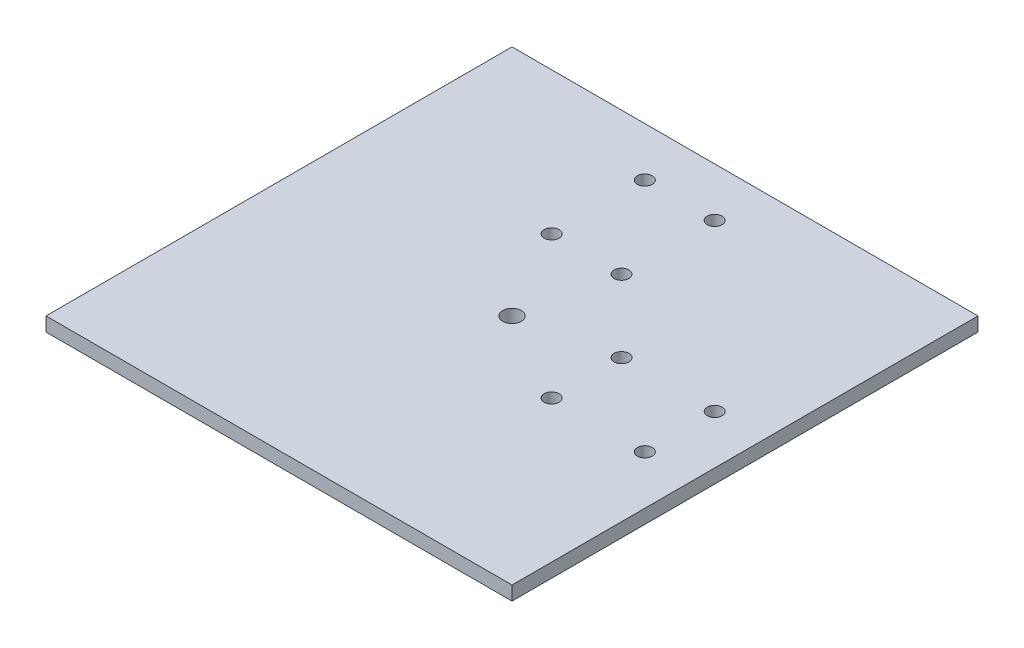
ISO-10303-21;
HEADER;
FILE_DESCRIPTION(('STEP AP214'),'2;1');
FILE_NAME('part.step','',(''),(''),'','','');
FILE_SCHEMA(('AUTOMOTIVE_DESIGN { 1 0 10303 214 1 1 1 1 }'));
ENDSEC;
DATA;
#1=APPLICATION_CONTEXT('core data for automotive mechanical design processes');
#2=APPLICATION_PROTOCOL_DEFINITION('international standard','automotive_design',2000,#1);
#3=PRODUCT_CONTEXT('',#1,'mechanical');
#4=PRODUCT('Part','Part','',(#3));
#5=PRODUCT_RELATED_PRODUCT_CATEGORY('part','',(#4));
#6=PRODUCT_DEFINITION_FORMATION('','',#4);
#7=PRODUCT_DEFINITION_CONTEXT('part definition',#1,'design');
#8=PRODUCT_DEFINITION('design','',#6,#7);
#9=PRODUCT_DEFINITION_SHAPE('','',#8);
#10=(LENGTH_UNIT() NAMED_UNIT(*) SI_UNIT(.MILLI.,.METRE.));
#11=(NAMED_UNIT(*) PLANE_ANGLE_UNIT() SI_UNIT($,.RADIAN.));
#12=(NAMED_UNIT(*) SI_UNIT($,.STERADIAN.) SOLID_ANGLE_UNIT());
#13=UNCERTAINTY_MEASURE_WITH_UNIT(LENGTH_MEASURE(1.E-05),#10,'distance_accuracy_value','');
#14=(GEOMETRIC_REPRESENTATION_CONTEXT(3) GLOBAL_UNCERTAINTY_ASSIGNED_CONTEXT((#13)) GLOBAL_UNIT_ASSIGNED_CONTEXT((#10,
#11,#12)) REPRESENTATION_CONTEXT('',''));
#15=CARTESIAN_POINT('',(0.,0.,0.));
#16=DIRECTION('',(0.,0.,1.));
#17=DIRECTION('',(1.,0.,0.));
#18=AXIS2_PLACEMENT_3D('',#15,#16,#17);
#19=CARTESIAN_POINT('',(-50.,3.,50.));
#20=DIRECTION('',(1.,0.,0.));
#21=DIRECTION('',(0.,0.,-1.));
#22=AXIS2_PLACEMENT_3D('',#19,#20,#21);
#23=PLANE('',#22);
#24=DIRECTION('',(0.,0.,1.));
#25=VECTOR('',#24,1.);
#26=CARTESIAN_POINT('',(-50.,0.,50.));
#27=LINE('',#26,#25);
#28=CARTESIAN_POINT('',(-50.,0.,-50.));
#29=VERTEX_POINT('',#28);
#30=CARTESIAN_POINT('',(-50.,0.,50.));
#31=VERTEX_POINT('',#30);
#32=EDGE_CURVE('E106',#29,#31,#27,.T.);
#33=ORIENTED_EDGE('',*,*,#32,.T.);
#34=DIRECTION('',(0.,-1.,0.));
#35=VECTOR('',#34,1.);
#36=CARTESIAN_POINT('',(-50.,3.,50.));
#37=LINE('',#36,#35);
#38=CARTESIAN_POINT('',(-50.,3.,50.));
#39=VERTEX_POINT('',#38);
#40=EDGE_CURVE('E97',#39,#31,#37,.T.);
#41=ORIENTED_EDGE('',*,*,#40,.F.);
#42=DIRECTION('',(0.,0.,1.));
#43=VECTOR('',#42,1.);
#44=CARTESIAN_POINT('',(-50.,3.,50.));
#45=LINE('',#44,#43);
#46=CARTESIAN_POINT('',(-50.,3.,-50.));
#47=VERTEX_POINT('',#46);
#48=EDGE_CURVE('E91',#47,#39,#45,.T.);
#49=ORIENTED_EDGE('',*,*,#48,.F.);
#50=DIRECTION('',(0.,-1.,0.));
#51=VECTOR('',#50,1.);
#52=CARTESIAN_POINT('',(-50.,3.,-50.));
#53=LINE('',#52,#51);
#54=EDGE_CURVE('E102',#47,#29,#53,.T.);
#55=ORIENTED_EDGE('',*,*,#54,.T.);
#56=EDGE_LOOP('',(#33,#41,#49,#55));
#57=FACE_BOUND('',#56,.T.);
#58=ADVANCED_FACE('F37',(#57),#23,.F.);
#59=CARTESIAN_POINT('',(50.,3.,50.));
#60=DIRECTION('',(0.,0.,-1.));
#61=DIRECTION('',(-1.,0.,0.));
#62=AXIS2_PLACEMENT_3D('',#59,#60,#61);
#63=PLANE('',#62);
#64=DIRECTION('',(1.,0.,0.));
#65=VECTOR('',#64,1.);
#66=CARTESIAN_POINT('',(50.,0.,50.));
#67=LINE('',#66,#65);
#68=CARTESIAN_POINT('',(50.,0.,50.));
#69=VERTEX_POINT('',#68);
#70=EDGE_CURVE('E96',#31,#69,#67,.T.);
#71=ORIENTED_EDGE('',*,*,#70,.T.);
#72=DIRECTION('',(0.,-1.,0.));
#73=VECTOR('',#72,1.);
#74=CARTESIAN_POINT('',(50.,3.,50.));
#75=LINE('',#74,#73);
#76=CARTESIAN_POINT('',(50.,3.,50.));
#77=VERTEX_POINT('',#76);
#78=EDGE_CURVE('E94',#77,#69,#75,.T.);
#79=ORIENTED_EDGE('',*,*,#78,.F.);
#80=DIRECTION('',(1.,0.,0.));
#81=VECTOR('',#80,1.);
#82=CARTESIAN_POINT('',(50.,3.,50.));
#83=LINE('',#82,#81);
#84=EDGE_CURVE('E86',#39,#77,#83,.T.);
#85=ORIENTED_EDGE('',*,*,#84,.F.);
#86=ORIENTED_EDGE('',*,*,#40,.T.);
#87=EDGE_LOOP('',(#71,#79,#85,#86));
#88=FACE_BOUND('',#87,.T.);
#89=ADVANCED_FACE('F95',(#88),#63,.F.);
#90=CARTESIAN_POINT('',(50.,3.,50.));
#91=DIRECTION('',(-1.,0.,0.));
#92=DIRECTION('',(0.,0.,1.));
#93=AXIS2_PLACEMENT_3D('',#90,#91,#92);
#94=PLANE('',#93);
#95=DIRECTION('',(0.,0.,-1.));
#96=VECTOR('',#95,1.);
#97=CARTESIAN_POINT('',(50.,0.,50.));
#98=LINE('',#97,#96);
#99=CARTESIAN_POINT('',(50.,0.,-50.));
#100=VERTEX_POINT('',#99);
#101=EDGE_CURVE('E72',#69,#100,#98,.T.);
#102=ORIENTED_EDGE('',*,*,#101,.T.);
#103=DIRECTION('',(0.,-1.,0.));
#104=VECTOR('',#103,1.);
#105=CARTESIAN_POINT('',(50.,3.,-50.));
#106=LINE('',#105,#104);
#107=CARTESIAN_POINT('',(50.,3.,-50.));
#108=VERTEX_POINT('',#107);
#109=EDGE_CURVE('E98',#108,#100,#106,.T.);
#110=ORIENTED_EDGE('',*,*,#109,.F.);
#111=DIRECTION('',(0.,0.,-1.));
#112=VECTOR('',#111,1.);
#113=CARTESIAN_POINT('',(50.,3.,50.));
#114=LINE('',#113,#112);
#115=EDGE_CURVE('E89',#77,#108,#114,.T.);
#116=ORIENTED_EDGE('',*,*,#115,.F.);
#117=ORIENTED_EDGE('',*,*,#78,.T.);
#118=EDGE_LOOP('',(#102,#110,#116,#117));
#119=FACE_BOUND('',#118,.T.);
#120=ADVANCED_FACE('F100',(#119),#94,.F.);
#121=CARTESIAN_POINT('',(50.,3.,-50.));
#122=DIRECTION('',(0.,0.,1.));
#123=DIRECTION('',(1.,0.,0.));
#124=AXIS2_PLACEMENT_3D('',#121,#122,#123);
#125=PLANE('',#124);
#126=DIRECTION('',(-1.,0.,0.));
#127=VECTOR('',#126,1.);
#128=CARTESIAN_POINT('',(50.,0.,-50.));
#129=LINE('',#128,#127);
#130=EDGE_CURVE('E78',#100,#29,#129,.T.);
#131=ORIENTED_EDGE('',*,*,#130,.T.);
#132=ORIENTED_EDGE('',*,*,#54,.F.);
#133=DIRECTION('',(-1.,0.,0.));
#134=VECTOR('',#133,1.);
#135=CARTESIAN_POINT('',(50.,3.,-50.));
#136=LINE('',#135,#134);
#137=EDGE_CURVE('E55',#108,#47,#136,.T.);
#138=ORIENTED_EDGE('',*,*,#137,.F.);
#139=ORIENTED_EDGE('',*,*,#109,.T.);
#140=EDGE_LOOP('',(#131,#132,#138,#139));
#141=FACE_BOUND('',#140,.T.);
#142=ADVANCED_FACE('F176',(#141),#125,.F.);
#143=CARTESIAN_POINT('',(0.,3.,0.));
#144=DIRECTION('',(0.,1.,0.));
#145=DIRECTION('',(0.,0.,1.));
#146=AXIS2_PLACEMENT_3D('',#143,#144,#145);
#147=PLANE('',#146);
#148=CARTESIAN_POINT('',(0.,3.,0.));
#149=DIRECTION('',(0.,1.,0.));
#150=DIRECTION('',(0.,0.,1.));
#151=AXIS2_PLACEMENT_3D('',#148,#149,#150);
#152=CIRCLE('',#151,2.);
#153=CARTESIAN_POINT('',(0.,3.,2.));
#154=VERTEX_POINT('',#153);
#155=EDGE_CURVE('E435',#154,#154,#152,.T.);
#156=ORIENTED_EDGE('',*,*,#155,.F.);
#157=EDGE_LOOP('',(#156));
#158=FACE_BOUND('',#157,.T.);
#159=CARTESIAN_POINT('',(-11.,3.,-39.5));
#160=DIRECTION('',(0.,1.,0.));
#161=DIRECTION('',(0.,0.,1.));
#162=AXIS2_PLACEMENT_3D('',#159,#160,#161);
#163=CIRCLE('',#162,1.6);
#164=CARTESIAN_POINT('',(-11.,3.,-37.9));
#165=VERTEX_POINT('',#164);
#166=EDGE_CURVE('E439',#165,#165,#163,.T.);
#167=ORIENTED_EDGE('',*,*,#166,.F.);
#168=EDGE_LOOP('',(#167));
#169=FACE_BOUND('',#168,.T.);
#170=CARTESIAN_POINT('',(4.,3.,-39.5));
#171=DIRECTION('',(0.,1.,0.));
#172=DIRECTION('',(0.,0.,1.));
#173=AXIS2_PLACEMENT_3D('',#170,#171,#172);
#174=CIRCLE('',#173,1.6);
#175=CARTESIAN_POINT('',(4.,3.,-37.9));
#176=VERTEX_POINT('',#175);
#177=EDGE_CURVE('E448',#176,#176,#174,.T.);
#178=ORIENTED_EDGE('',*,*,#177,.F.);
#179=EDGE_LOOP('',(#178));
#180=FACE_BOUND('',#179,.T.);
#181=CARTESIAN_POINT('',(4.,3.,-19.5));
#182=DIRECTION('',(0.,1.,0.));
#183=DIRECTION('',(0.,0.,1.));
#184=AXIS2_PLACEMENT_3D('',#181,#182,#183);
#185=CIRCLE('',#184,1.6);
#186=CARTESIAN_POINT('',(4.,3.,-17.9));
#187=VERTEX_POINT('',#186);
#188=EDGE_CURVE('E454',#187,#187,#185,.T.);
#189=ORIENTED_EDGE('',*,*,#188,.F.);
#190=EDGE_LOOP('',(#189));
#191=FACE_BOUND('',#190,.T.);
#192=CARTESIAN_POINT('',(-11.,3.,-19.5));
#193=DIRECTION('',(0.,1.,0.));
#194=DIRECTION('',(0.,0.,1.));
#195=AXIS2_PLACEMENT_3D('',#192,#193,#194);
#196=CIRCLE('',#195,1.6);
#197=CARTESIAN_POINT('',(-11.,3.,-17.9));
#198=VERTEX_POINT('',#197);
#199=EDGE_CURVE('E460',#198,#198,#196,.T.);
#200=ORIENTED_EDGE('',*,*,#199,.F.);
#201=EDGE_LOOP('',(#200));
#202=FACE_BOUND('',#201,.T.);
#203=CARTESIAN_POINT('',(19.5,3.,-3.99999999999999));
#204=DIRECTION('',(0.,1.,0.));
#205=DIRECTION('',(0.,0.,1.));
#206=AXIS2_PLACEMENT_3D('',#203,#204,#205);
#207=CIRCLE('',#206,1.6);
#208=CARTESIAN_POINT('',(19.5,3.,-2.39999999999999));
#209=VERTEX_POINT('',#208);
#210=EDGE_CURVE('E144',#209,#209,#207,.T.);
#211=ORIENTED_EDGE('',*,*,#210,.F.);
#212=EDGE_LOOP('',(#211));
#213=FACE_BOUND('',#212,.T.);
#214=CARTESIAN_POINT('',(39.5,3.,-4.));
#215=DIRECTION('',(0.,1.,0.));
#216=DIRECTION('',(0.,0.,1.));
#217=AXIS2_PLACEMENT_3D('',#214,#215,#216);
#218=CIRCLE('',#217,1.6);
#219=CARTESIAN_POINT('',(39.5,3.,-2.4));
#220=VERTEX_POINT('',#219);
#221=EDGE_CURVE('E134',#220,#220,#218,.T.);
#222=ORIENTED_EDGE('',*,*,#221,.F.);
#223=EDGE_LOOP('',(#222));
#224=FACE_BOUND('',#223,.T.);
#225=CARTESIAN_POINT('',(39.5,3.,11.));
#226=DIRECTION('',(0.,1.,0.));
#227=DIRECTION('',(0.,0.,1.));
#228=AXIS2_PLACEMENT_3D('',#225,#226,#227);
#229=CIRCLE('',#228,1.6);
#230=CARTESIAN_POINT('',(39.5,3.,12.6));
#231=VERTEX_POINT('',#230);
#232=EDGE_CURVE('E131',#231,#231,#229,.T.);
#233=ORIENTED_EDGE('',*,*,#232,.F.);
#234=EDGE_LOOP('',(#233));
#235=FACE_BOUND('',#234,.T.);
#236=CARTESIAN_POINT('',(19.5,3.,11.));
#237=DIRECTION('',(0.,1.,0.));
#238=DIRECTION('',(0.,0.,1.));
#239=AXIS2_PLACEMENT_3D('',#236,#237,#238);
#240=CIRCLE('',#239,1.6);
#241=CARTESIAN_POINT('',(19.5,3.,12.6));
#242=VERTEX_POINT('',#241);
#243=EDGE_CURVE('E128',#242,#242,#240,.T.);
#244=ORIENTED_EDGE('',*,*,#243,.F.);
#245=EDGE_LOOP('',(#244));
#246=FACE_BOUND('',#245,.T.);
#247=ORIENTED_EDGE('',*,*,#48,.T.);
#248=ORIENTED_EDGE('',*,*,#84,.T.);
#249=ORIENTED_EDGE('',*,*,#115,.T.);
#250=ORIENTED_EDGE('',*,*,#137,.T.);
#251=EDGE_LOOP('',(#247,#248,#249,#250));
#252=FACE_BOUND('',#251,.T.);
#253=ADVANCED_FACE('F87',(#158,#169,#180,#191,#202,#213,#224,#235,#246,#252),#147,.T.);
#254=CARTESIAN_POINT('',(0.,0.,0.));
#255=DIRECTION('',(0.,1.,0.));
#256=DIRECTION('',(0.,0.,1.));
#257=AXIS2_PLACEMENT_3D('',#254,#255,#256);
#258=PLANE('',#257);
#259=CARTESIAN_POINT('',(0.,0.,0.));
#260=DIRECTION('',(0.,1.,0.));
#261=DIRECTION('',(0.,0.,1.));
#262=AXIS2_PLACEMENT_3D('',#259,#260,#261);
#263=CIRCLE('',#262,2.);
#264=CARTESIAN_POINT('',(0.,0.,2.));
#265=VERTEX_POINT('',#264);
#266=EDGE_CURVE('E438',#265,#265,#263,.T.);
#267=ORIENTED_EDGE('',*,*,#266,.T.);
#268=EDGE_LOOP('',(#267));
#269=FACE_BOUND('',#268,.T.);
#270=CARTESIAN_POINT('',(19.5,0.,-3.99999999999999));
#271=DIRECTION('',(0.,1.,0.));
#272=DIRECTION('',(0.,0.,1.));
#273=AXIS2_PLACEMENT_3D('',#270,#271,#272);
#274=CIRCLE('',#273,1.6);
#275=CARTESIAN_POINT('',(19.5,0.,-2.4));
#276=VERTEX_POINT('',#275);
#277=EDGE_CURVE('E40',#276,#276,#274,.T.);
#278=ORIENTED_EDGE('',*,*,#277,.T.);
#279=EDGE_LOOP('',(#278));
#280=FACE_BOUND('',#279,.T.);
#281=CARTESIAN_POINT('',(39.5,0.,-4.));
#282=DIRECTION('',(0.,1.,0.));
#283=DIRECTION('',(0.,0.,1.));
#284=AXIS2_PLACEMENT_3D('',#281,#282,#283);
#285=CIRCLE('',#284,1.6);
#286=CARTESIAN_POINT('',(39.5,0.,-2.4));
#287=VERTEX_POINT('',#286);
#288=EDGE_CURVE('E132',#287,#287,#285,.T.);
#289=ORIENTED_EDGE('',*,*,#288,.T.);
#290=EDGE_LOOP('',(#289));
#291=FACE_BOUND('',#290,.T.);
#292=CARTESIAN_POINT('',(39.5,0.,11.));
#293=DIRECTION('',(0.,1.,0.));
#294=DIRECTION('',(0.,0.,1.));
#295=AXIS2_PLACEMENT_3D('',#292,#293,#294);
#296=CIRCLE('',#295,1.6);
#297=CARTESIAN_POINT('',(39.5,0.,12.6));
#298=VERTEX_POINT('',#297);
#299=EDGE_CURVE('E129',#298,#298,#296,.T.);
#300=ORIENTED_EDGE('',*,*,#299,.T.);
#301=EDGE_LOOP('',(#300));
#302=FACE_BOUND('',#301,.T.);
#303=CARTESIAN_POINT('',(19.5,0.,11.));
#304=DIRECTION('',(0.,1.,0.));
#305=DIRECTION('',(0.,0.,1.));
#306=AXIS2_PLACEMENT_3D('',#303,#304,#305);
#307=CIRCLE('',#306,1.6);
#308=CARTESIAN_POINT('',(19.5,0.,12.6));
#309=VERTEX_POINT('',#308);
#310=EDGE_CURVE('E124',#309,#309,#307,.T.);
#311=ORIENTED_EDGE('',*,*,#310,.T.);
#312=EDGE_LOOP('',(#311));
#313=FACE_BOUND('',#312,.T.);
#314=CARTESIAN_POINT('',(-11.,0.,-39.5));
#315=DIRECTION('',(0.,1.,0.));
#316=DIRECTION('',(0.,0.,1.));
#317=AXIS2_PLACEMENT_3D('',#314,#315,#316);
#318=CIRCLE('',#317,3.);
#319=CARTESIAN_POINT('',(-11.,0.,-36.5));
#320=VERTEX_POINT('',#319);
#321=EDGE_CURVE('E11',#320,#320,#318,.F.);
#322=ORIENTED_EDGE('',*,*,#321,.F.);
#323=EDGE_LOOP('',(#322));
#324=FACE_BOUND('',#323,.T.);
#325=CARTESIAN_POINT('',(4.,0.,-39.5));
#326=DIRECTION('',(0.,1.,0.));
#327=DIRECTION('',(0.,0.,1.));
#328=AXIS2_PLACEMENT_3D('',#325,#326,#327);
#329=CIRCLE('',#328,3.);
#330=CARTESIAN_POINT('',(4.,0.,-36.5));
#331=VERTEX_POINT('',#330);
#332=EDGE_CURVE('E46',#331,#331,#329,.F.);
#333=ORIENTED_EDGE('',*,*,#332,.F.);
#334=EDGE_LOOP('',(#333));
#335=FACE_BOUND('',#334,.T.);
#336=CARTESIAN_POINT('',(4.,0.,-19.5));
#337=DIRECTION('',(0.,1.,0.));
#338=DIRECTION('',(0.,0.,1.));
#339=AXIS2_PLACEMENT_3D('',#336,#337,#338);
#340=CIRCLE('',#339,3.);
#341=CARTESIAN_POINT('',(4.,0.,-16.5));
#342=VERTEX_POINT('',#341);
#343=EDGE_CURVE('E119',#342,#342,#340,.F.);
#344=ORIENTED_EDGE('',*,*,#343,.F.);
#345=EDGE_LOOP('',(#344));
#346=FACE_BOUND('',#345,.T.);
#347=CARTESIAN_POINT('',(-11.,0.,-19.5));
#348=DIRECTION('',(0.,1.,0.));
#349=DIRECTION('',(0.,0.,1.));
#350=AXIS2_PLACEMENT_3D('',#347,#348,#349);
#351=CIRCLE('',#350,3.);
#352=CARTESIAN_POINT('',(-11.,0.,-16.5));
#353=VERTEX_POINT('',#352);
#354=EDGE_CURVE('E116',#353,#353,#351,.F.);
#355=ORIENTED_EDGE('',*,*,#354,.F.);
#356=EDGE_LOOP('',(#355));
#357=FACE_BOUND('',#356,.T.);
#358=ORIENTED_EDGE('',*,*,#32,.F.);
#359=ORIENTED_EDGE('',*,*,#130,.F.);
#360=ORIENTED_EDGE('',*,*,#101,.F.);
#361=ORIENTED_EDGE('',*,*,#70,.F.);
#362=EDGE_LOOP('',(#358,#359,#360,#361));
#363=FACE_BOUND('',#362,.T.);
#364=ADVANCED_FACE('F166',(#269,#280,#291,#302,#313,#324,#335,#346,#357,#363),#258,.F.);
#365=CARTESIAN_POINT('',(-11.,-15.1,-19.5));
#366=DIRECTION('',(0.,1.,0.));
#367=DIRECTION('',(0.,0.,1.));
#368=AXIS2_PLACEMENT_3D('',#365,#366,#367);
#369=CYLINDRICAL_SURFACE('',#368,3.);
#370=CARTESIAN_POINT('',(-11.,-15.1,-19.5));
#371=DIRECTION('',(0.,-1.,0.));
#372=DIRECTION('',(0.,0.,-1.));
#373=AXIS2_PLACEMENT_3D('',#370,#371,#372);
#374=CIRCLE('',#373,3.);
#375=CARTESIAN_POINT('',(-11.,-15.1,-22.5));
#376=VERTEX_POINT('',#375);
#377=EDGE_CURVE('E109',#376,#376,#374,.T.);
#378=ORIENTED_EDGE('',*,*,#377,.F.);
#379=EDGE_LOOP('',(#378));
#380=FACE_BOUND('',#379,.T.);
#381=ORIENTED_EDGE('',*,*,#354,.T.);
#382=EDGE_LOOP('',(#381));
#383=FACE_BOUND('',#382,.T.);
#384=ADVANCED_FACE('F163',(#380,#383),#369,.T.);
#385=CARTESIAN_POINT('',(-11.,-15.1,-19.5));
#386=DIRECTION('',(0.,-1.,0.));
#387=DIRECTION('',(0.,0.,-1.));
#388=AXIS2_PLACEMENT_3D('',#385,#386,#387);
#389=PLANE('',#388);
#390=CARTESIAN_POINT('',(-11.,-15.1,-19.5));
#391=DIRECTION('',(0.,1.,0.));
#392=DIRECTION('',(0.,0.,1.));
#393=AXIS2_PLACEMENT_3D('',#390,#391,#392);
#394=CIRCLE('',#393,1.6);
#395=CARTESIAN_POINT('',(-11.,-15.1,-17.9));
#396=VERTEX_POINT('',#395);
#397=EDGE_CURVE('E462',#396,#396,#394,.T.);
#398=ORIENTED_EDGE('',*,*,#397,.T.);
#399=EDGE_LOOP('',(#398));
#400=FACE_BOUND('',#399,.T.);
#401=ORIENTED_EDGE('',*,*,#377,.T.);
#402=EDGE_LOOP('',(#401));
#403=FACE_BOUND('',#402,.T.);
#404=ADVANCED_FACE('F161',(#400,#403),#389,.T.);
#405=CARTESIAN_POINT('',(4.,-15.1,-19.5));
#406=DIRECTION('',(0.,1.,0.));
#407=DIRECTION('',(0.,0.,1.));
#408=AXIS2_PLACEMENT_3D('',#405,#406,#407);
#409=CYLINDRICAL_SURFACE('',#408,3.);
#410=CARTESIAN_POINT('',(4.,-15.1,-19.5));
#411=DIRECTION('',(0.,-1.,0.));
#412=DIRECTION('',(0.,0.,-1.));
#413=AXIS2_PLACEMENT_3D('',#410,#411,#412);
#414=CIRCLE('',#413,3.);
#415=CARTESIAN_POINT('',(4.,-15.1,-22.5));
#416=VERTEX_POINT('',#415);
#417=EDGE_CURVE('E155',#416,#416,#414,.T.);
#418=ORIENTED_EDGE('',*,*,#417,.F.);
#419=EDGE_LOOP('',(#418));
#420=FACE_BOUND('',#419,.T.);
#421=ORIENTED_EDGE('',*,*,#343,.T.);
#422=EDGE_LOOP('',(#421));
#423=FACE_BOUND('',#422,.T.);
#424=ADVANCED_FACE('F218',(#420,#423),#409,.T.);
#425=CARTESIAN_POINT('',(4.,-15.1,-19.5));
#426=DIRECTION('',(0.,-1.,0.));
#427=DIRECTION('',(0.,0.,-1.));
#428=AXIS2_PLACEMENT_3D('',#425,#426,#427);
#429=PLANE('',#428);
#430=CARTESIAN_POINT('',(4.,-15.1,-19.5));
#431=DIRECTION('',(0.,1.,0.));
#432=DIRECTION('',(0.,0.,1.));
#433=AXIS2_PLACEMENT_3D('',#430,#431,#432);
#434=CIRCLE('',#433,1.6);
#435=CARTESIAN_POINT('',(4.,-15.1,-17.9));
#436=VERTEX_POINT('',#435);
#437=EDGE_CURVE('E457',#436,#436,#434,.T.);
#438=ORIENTED_EDGE('',*,*,#437,.T.);
#439=EDGE_LOOP('',(#438));
#440=FACE_BOUND('',#439,.T.);
#441=ORIENTED_EDGE('',*,*,#417,.T.);
#442=EDGE_LOOP('',(#441));
#443=FACE_BOUND('',#442,.T.);
#444=ADVANCED_FACE('F223',(#440,#443),#429,.T.);
#445=CARTESIAN_POINT('',(4.,-15.1,-39.5));
#446=DIRECTION('',(0.,1.,0.));
#447=DIRECTION('',(0.,0.,1.));
#448=AXIS2_PLACEMENT_3D('',#445,#446,#447);
#449=CYLINDRICAL_SURFACE('',#448,3.);
#450=CARTESIAN_POINT('',(4.,-15.1,-39.5));
#451=DIRECTION('',(0.,-1.,0.));
#452=DIRECTION('',(0.,0.,-1.));
#453=AXIS2_PLACEMENT_3D('',#450,#451,#452);
#454=CIRCLE('',#453,3.);
#455=CARTESIAN_POINT('',(4.,-15.1,-42.5));
#456=VERTEX_POINT('',#455);
#457=EDGE_CURVE('E152',#456,#456,#454,.T.);
#458=ORIENTED_EDGE('',*,*,#457,.F.);
#459=EDGE_LOOP('',(#458));
#460=FACE_BOUND('',#459,.T.);
#461=ORIENTED_EDGE('',*,*,#332,.T.);
#462=EDGE_LOOP('',(#461));
#463=FACE_BOUND('',#462,.T.);
#464=ADVANCED_FACE('F232',(#460,#463),#449,.T.);
#465=CARTESIAN_POINT('',(4.,-15.1,-39.5));
#466=DIRECTION('',(0.,-1.,0.));
#467=DIRECTION('',(0.,0.,-1.));
#468=AXIS2_PLACEMENT_3D('',#465,#466,#467);
#469=PLANE('',#468);
#470=CARTESIAN_POINT('',(4.,-15.1,-39.5));
#471=DIRECTION('',(0.,1.,0.));
#472=DIRECTION('',(0.,0.,1.));
#473=AXIS2_PLACEMENT_3D('',#470,#471,#472);
#474=CIRCLE('',#473,1.6);
#475=CARTESIAN_POINT('',(4.,-15.1,-37.9));
#476=VERTEX_POINT('',#475);
#477=EDGE_CURVE('E451',#476,#476,#474,.T.);
#478=ORIENTED_EDGE('',*,*,#477,.T.);
#479=EDGE_LOOP('',(#478));
#480=FACE_BOUND('',#479,.T.);
#481=ORIENTED_EDGE('',*,*,#457,.T.);
#482=EDGE_LOOP('',(#481));
#483=FACE_BOUND('',#482,.T.);
#484=ADVANCED_FACE('F237',(#480,#483),#469,.T.);
#485=CARTESIAN_POINT('',(-11.,-15.1,-39.5));
#486=DIRECTION('',(0.,1.,0.));
#487=DIRECTION('',(0.,0.,1.));
#488=AXIS2_PLACEMENT_3D('',#485,#486,#487);
#489=CYLINDRICAL_SURFACE('',#488,3.);
#490=CARTESIAN_POINT('',(-11.,-15.1,-39.5));
#491=DIRECTION('',(0.,-1.,0.));
#492=DIRECTION('',(0.,0.,-1.));
#493=AXIS2_PLACEMENT_3D('',#490,#491,#492);
#494=CIRCLE('',#493,3.);
#495=CARTESIAN_POINT('',(-11.,-15.1,-42.5));
#496=VERTEX_POINT('',#495);
#497=EDGE_CURVE('E127',#496,#496,#494,.T.);
#498=ORIENTED_EDGE('',*,*,#497,.F.);
#499=EDGE_LOOP('',(#498));
#500=FACE_BOUND('',#499,.T.);
#501=ORIENTED_EDGE('',*,*,#321,.T.);
#502=EDGE_LOOP('',(#501));
#503=FACE_BOUND('',#502,.T.);
#504=ADVANCED_FACE('F246',(#500,#503),#489,.T.);
#505=CARTESIAN_POINT('',(-11.,-15.1,-39.5));
#506=DIRECTION('',(0.,-1.,0.));
#507=DIRECTION('',(0.,0.,-1.));
#508=AXIS2_PLACEMENT_3D('',#505,#506,#507);
#509=PLANE('',#508);
#510=CARTESIAN_POINT('',(-11.,-15.1,-39.5));
#511=DIRECTION('',(0.,1.,0.));
#512=DIRECTION('',(0.,0.,1.));
#513=AXIS2_PLACEMENT_3D('',#510,#511,#512);
#514=CIRCLE('',#513,1.6);
#515=CARTESIAN_POINT('',(-11.,-15.1,-37.9));
#516=VERTEX_POINT('',#515);
#517=EDGE_CURVE('E442',#516,#516,#514,.T.);
#518=ORIENTED_EDGE('',*,*,#517,.T.);
#519=EDGE_LOOP('',(#518));
#520=FACE_BOUND('',#519,.T.);
#521=ORIENTED_EDGE('',*,*,#497,.T.);
#522=EDGE_LOOP('',(#521));
#523=FACE_BOUND('',#522,.T.);
#524=ADVANCED_FACE('F251',(#520,#523),#509,.T.);
#525=CARTESIAN_POINT('',(19.5,3.,11.));
#526=DIRECTION('',(0.,1.,0.));
#527=DIRECTION('',(0.,0.,1.));
#528=AXIS2_PLACEMENT_3D('',#525,#526,#527);
#529=CYLINDRICAL_SURFACE('',#528,1.6);
#530=ORIENTED_EDGE('',*,*,#243,.T.);
#531=EDGE_LOOP('',(#530));
#532=FACE_BOUND('',#531,.T.);
#533=ORIENTED_EDGE('',*,*,#310,.F.);
#534=EDGE_LOOP('',(#533));
#535=FACE_BOUND('',#534,.T.);
#536=ADVANCED_FACE('F286',(#532,#535),#529,.F.);
#537=CARTESIAN_POINT('',(39.5,3.,11.));
#538=DIRECTION('',(0.,1.,0.));
#539=DIRECTION('',(0.,0.,1.));
#540=AXIS2_PLACEMENT_3D('',#537,#538,#539);
#541=CYLINDRICAL_SURFACE('',#540,1.6);
#542=ORIENTED_EDGE('',*,*,#232,.T.);
#543=EDGE_LOOP('',(#542));
#544=FACE_BOUND('',#543,.T.);
#545=ORIENTED_EDGE('',*,*,#299,.F.);
#546=EDGE_LOOP('',(#545));
#547=FACE_BOUND('',#546,.T.);
#548=ADVANCED_FACE('F297',(#544,#547),#541,.F.);
#549=CARTESIAN_POINT('',(39.5,3.,-4.));
#550=DIRECTION('',(0.,1.,0.));
#551=DIRECTION('',(0.,0.,1.));
#552=AXIS2_PLACEMENT_3D('',#549,#550,#551);
#553=CYLINDRICAL_SURFACE('',#552,1.6);
#554=ORIENTED_EDGE('',*,*,#221,.T.);
#555=EDGE_LOOP('',(#554));
#556=FACE_BOUND('',#555,.T.);
#557=ORIENTED_EDGE('',*,*,#288,.F.);
#558=EDGE_LOOP('',(#557));
#559=FACE_BOUND('',#558,.T.);
#560=ADVANCED_FACE('F308',(#556,#559),#553,.F.);
#561=CARTESIAN_POINT('',(19.5,3.,-3.99999999999999));
#562=DIRECTION('',(0.,1.,0.));
#563=DIRECTION('',(0.,0.,1.));
#564=AXIS2_PLACEMENT_3D('',#561,#562,#563);
#565=CYLINDRICAL_SURFACE('',#564,1.6);
#566=ORIENTED_EDGE('',*,*,#210,.T.);
#567=EDGE_LOOP('',(#566));
#568=FACE_BOUND('',#567,.T.);
#569=ORIENTED_EDGE('',*,*,#277,.F.);
#570=EDGE_LOOP('',(#569));
#571=FACE_BOUND('',#570,.T.);
#572=ADVANCED_FACE('F319',(#568,#571),#565,.F.);
#573=CARTESIAN_POINT('',(-11.,3.,-19.5));
#574=DIRECTION('',(0.,1.,0.));
#575=DIRECTION('',(0.,0.,1.));
#576=AXIS2_PLACEMENT_3D('',#573,#574,#575);
#577=CYLINDRICAL_SURFACE('',#576,1.6);
#578=ORIENTED_EDGE('',*,*,#397,.F.);
#579=EDGE_LOOP('',(#578));
#580=FACE_BOUND('',#579,.T.);
#581=ORIENTED_EDGE('',*,*,#199,.T.);
#582=EDGE_LOOP('',(#581));
#583=FACE_BOUND('',#582,.T.);
#584=ADVANCED_FACE('F329',(#580,#583),#577,.F.);
#585=CARTESIAN_POINT('',(4.,3.,-19.5));
#586=DIRECTION('',(0.,1.,0.));
#587=DIRECTION('',(0.,0.,1.));
#588=AXIS2_PLACEMENT_3D('',#585,#586,#587);
#589=CYLINDRICAL_SURFACE('',#588,1.6);
#590=ORIENTED_EDGE('',*,*,#437,.F.);
#591=EDGE_LOOP('',(#590));
#592=FACE_BOUND('',#591,.T.);
#593=ORIENTED_EDGE('',*,*,#188,.T.);
#594=EDGE_LOOP('',(#593));
#595=FACE_BOUND('',#594,.T.);
#596=ADVANCED_FACE('F340',(#592,#595),#589,.F.);
#597=CARTESIAN_POINT('',(4.,3.,-39.5));
#598=DIRECTION('',(0.,1.,0.));
#599=DIRECTION('',(0.,0.,1.));
#600=AXIS2_PLACEMENT_3D('',#597,#598,#599);
#601=CYLINDRICAL_SURFACE('',#600,1.6);
#602=ORIENTED_EDGE('',*,*,#477,.F.);
#603=EDGE_LOOP('',(#602));
#604=FACE_BOUND('',#603,.T.);
#605=ORIENTED_EDGE('',*,*,#177,.T.);
#606=EDGE_LOOP('',(#605));
#607=FACE_BOUND('',#606,.T.);
#608=ADVANCED_FACE('F351',(#604,#607),#601,.F.);
#609=CARTESIAN_POINT('',(-11.,3.,-39.5));
#610=DIRECTION('',(0.,1.,0.));
#611=DIRECTION('',(0.,0.,1.));
#612=AXIS2_PLACEMENT_3D('',#609,#610,#611);
#613=CYLINDRICAL_SURFACE('',#612,1.6);
#614=ORIENTED_EDGE('',*,*,#517,.F.);
#615=EDGE_LOOP('',(#614));
#616=FACE_BOUND('',#615,.T.);
#617=ORIENTED_EDGE('',*,*,#166,.T.);
#618=EDGE_LOOP('',(#617));
#619=FACE_BOUND('',#618,.T.);
#620=ADVANCED_FACE('F362',(#616,#619),#613,.F.);
#621=CARTESIAN_POINT('',(0.,3.,0.));
#622=DIRECTION('',(0.,1.,0.));
#623=DIRECTION('',(0.,0.,1.));
#624=AXIS2_PLACEMENT_3D('',#621,#622,#623);
#625=CYLINDRICAL_SURFACE('',#624,2.);
#626=ORIENTED_EDGE('',*,*,#155,.T.);
#627=EDGE_LOOP('',(#626));
#628=FACE_BOUND('',#627,.T.);
#629=ORIENTED_EDGE('',*,*,#266,.F.);
#630=EDGE_LOOP('',(#629));
#631=FACE_BOUND('',#630,.T.);
#632=ADVANCED_FACE('F373',(#628,#631),#625,.F.);
#633=CLOSED_SHELL('',(#58,#89,#120,#142,#253,#364,#384,#404,#424,#444,#464,#484,#504,#524,#536,
#548,#560,#572,#584,#596,#608,#620,#632));
#634=MANIFOLD_SOLID_BREP('B2',#633);
#635=ADVANCED_BREP_SHAPE_REPRESENTATION('',(#18,#634),#14);
#636=SHAPE_DEFINITION_REPRESENTATION(#9,#635);
ENDSEC;
END-ISO-10303-21;
